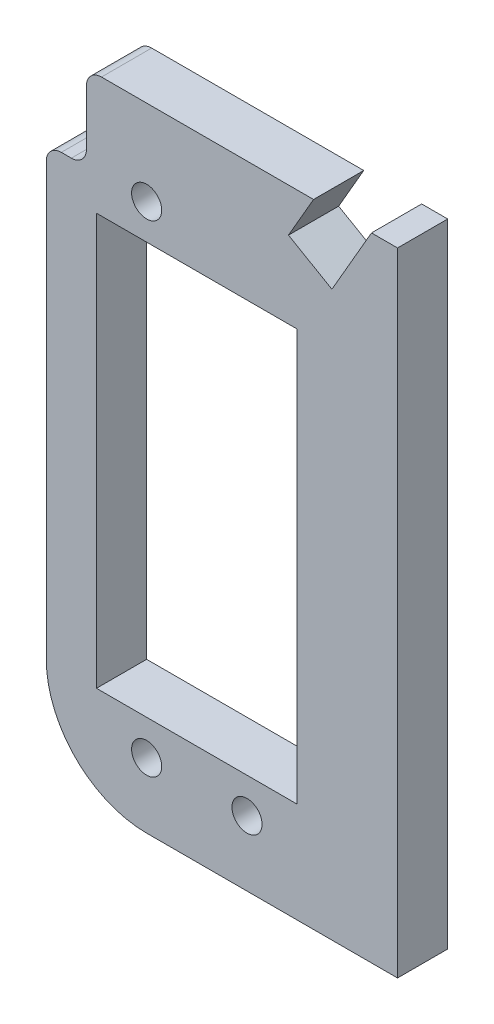
ISO-10303-21;
HEADER;
FILE_DESCRIPTION(('STEP AP214'),'2;1');
FILE_NAME('part.step','',(''),(''),'','','');
FILE_SCHEMA(('AUTOMOTIVE_DESIGN { 1 0 10303 214 1 1 1 1 }'));
ENDSEC;
DATA;
#1=APPLICATION_CONTEXT('core data for automotive mechanical design processes');
#2=APPLICATION_PROTOCOL_DEFINITION('international standard','automotive_design',2000,#1);
#3=PRODUCT_CONTEXT('',#1,'mechanical');
#4=PRODUCT('Part','Part','',(#3));
#5=PRODUCT_RELATED_PRODUCT_CATEGORY('part','',(#4));
#6=PRODUCT_DEFINITION_FORMATION('','',#4);
#7=PRODUCT_DEFINITION_CONTEXT('part definition',#1,'design');
#8=PRODUCT_DEFINITION('design','',#6,#7);
#9=PRODUCT_DEFINITION_SHAPE('','',#8);
#10=(LENGTH_UNIT() NAMED_UNIT(*) SI_UNIT(.MILLI.,.METRE.));
#11=(NAMED_UNIT(*) PLANE_ANGLE_UNIT() SI_UNIT($,.RADIAN.));
#12=(NAMED_UNIT(*) SI_UNIT($,.STERADIAN.) SOLID_ANGLE_UNIT());
#13=UNCERTAINTY_MEASURE_WITH_UNIT(LENGTH_MEASURE(1.E-05),#10,'distance_accuracy_value','');
#14=(GEOMETRIC_REPRESENTATION_CONTEXT(3) GLOBAL_UNCERTAINTY_ASSIGNED_CONTEXT((#13)) GLOBAL_UNIT_ASSIGNED_CONTEXT((#10,
#11,#12)) REPRESENTATION_CONTEXT('',''));
#15=CARTESIAN_POINT('',(0.,0.,0.));
#16=DIRECTION('',(0.,0.,1.));
#17=DIRECTION('',(1.,0.,0.));
#18=AXIS2_PLACEMENT_3D('',#15,#16,#17);
#19=CARTESIAN_POINT('',(0.,51.,5.));
#20=DIRECTION('',(0.,-1.,0.));
#21=DIRECTION('',(1.,0.,0.));
#22=AXIS2_PLACEMENT_3D('',#19,#20,#21);
#23=PLANE('',#22);
#24=DIRECTION('',(-1.,0.,0.));
#25=VECTOR('',#24,1.);
#26=CARTESIAN_POINT('',(0.,51.,0.));
#27=LINE('',#26,#25);
#28=CARTESIAN_POINT('',(25.,51.,0.));
#29=VERTEX_POINT('',#28);
#30=CARTESIAN_POINT('',(5.,51.,0.));
#31=VERTEX_POINT('',#30);
#32=EDGE_CURVE('E245',#29,#31,#27,.T.);
#33=ORIENTED_EDGE('',*,*,#32,.F.);
#34=DIRECTION('',(0.,0.,-1.));
#35=VECTOR('',#34,1.);
#36=CARTESIAN_POINT('',(25.,51.,5.));
#37=LINE('',#36,#35);
#38=CARTESIAN_POINT('',(25.,51.,5.));
#39=VERTEX_POINT('',#38);
#40=EDGE_CURVE('E272',#39,#29,#37,.T.);
#41=ORIENTED_EDGE('',*,*,#40,.F.);
#42=DIRECTION('',(-1.,0.,0.));
#43=VECTOR('',#42,1.);
#44=CARTESIAN_POINT('',(0.,51.,5.));
#45=LINE('',#44,#43);
#46=CARTESIAN_POINT('',(5.,51.,5.));
#47=VERTEX_POINT('',#46);
#48=EDGE_CURVE('E201',#39,#47,#45,.T.);
#49=ORIENTED_EDGE('',*,*,#48,.T.);
#50=DIRECTION('',(0.,0.,-1.));
#51=VECTOR('',#50,1.);
#52=CARTESIAN_POINT('',(5.,51.,5.));
#53=LINE('',#52,#51);
#54=EDGE_CURVE('E184',#47,#31,#53,.T.);
#55=ORIENTED_EDGE('',*,*,#54,.T.);
#56=EDGE_LOOP('',(#33,#41,#49,#55));
#57=FACE_BOUND('',#56,.T.);
#58=ADVANCED_FACE('F35',(#57),#23,.T.);
#59=CARTESIAN_POINT('',(25.,0.,5.));
#60=DIRECTION('',(-1.,0.,0.));
#61=DIRECTION('',(0.,0.,1.));
#62=AXIS2_PLACEMENT_3D('',#59,#60,#61);
#63=PLANE('',#62);
#64=DIRECTION('',(0.,1.,0.));
#65=VECTOR('',#64,1.);
#66=CARTESIAN_POINT('',(25.,0.,0.));
#67=LINE('',#66,#65);
#68=CARTESIAN_POINT('',(25.,10.,0.));
#69=VERTEX_POINT('',#68);
#70=EDGE_CURVE('E248',#69,#29,#67,.T.);
#71=ORIENTED_EDGE('',*,*,#70,.F.);
#72=DIRECTION('',(0.,0.,-1.));
#73=VECTOR('',#72,1.);
#74=CARTESIAN_POINT('',(25.,10.,5.));
#75=LINE('',#74,#73);
#76=CARTESIAN_POINT('',(25.,10.,5.));
#77=VERTEX_POINT('',#76);
#78=EDGE_CURVE('E270',#77,#69,#75,.T.);
#79=ORIENTED_EDGE('',*,*,#78,.F.);
#80=DIRECTION('',(0.,1.,0.));
#81=VECTOR('',#80,1.);
#82=CARTESIAN_POINT('',(25.,0.,5.));
#83=LINE('',#82,#81);
#84=EDGE_CURVE('E204',#77,#39,#83,.T.);
#85=ORIENTED_EDGE('',*,*,#84,.T.);
#86=ORIENTED_EDGE('',*,*,#40,.T.);
#87=EDGE_LOOP('',(#71,#79,#85,#86));
#88=FACE_BOUND('',#87,.T.);
#89=ADVANCED_FACE('F358',(#88),#63,.T.);
#90=CARTESIAN_POINT('',(0.,10.,5.));
#91=DIRECTION('',(0.,-1.,0.));
#92=DIRECTION('',(0.,0.,-1.));
#93=AXIS2_PLACEMENT_3D('',#90,#91,#92);
#94=PLANE('',#93);
#95=DIRECTION('',(-1.,0.,0.));
#96=VECTOR('',#95,1.);
#97=CARTESIAN_POINT('',(0.,10.,0.));
#98=LINE('',#97,#96);
#99=CARTESIAN_POINT('',(5.,10.,0.));
#100=VERTEX_POINT('',#99);
#101=EDGE_CURVE('E251',#69,#100,#98,.T.);
#102=ORIENTED_EDGE('',*,*,#101,.T.);
#103=DIRECTION('',(0.,0.,-1.));
#104=VECTOR('',#103,1.);
#105=CARTESIAN_POINT('',(5.,10.,5.));
#106=LINE('',#105,#104);
#107=CARTESIAN_POINT('',(5.,10.,5.));
#108=VERTEX_POINT('',#107);
#109=EDGE_CURVE('E268',#108,#100,#106,.T.);
#110=ORIENTED_EDGE('',*,*,#109,.F.);
#111=DIRECTION('',(-1.,0.,0.));
#112=VECTOR('',#111,1.);
#113=CARTESIAN_POINT('',(0.,10.,5.));
#114=LINE('',#113,#112);
#115=EDGE_CURVE('E207',#77,#108,#114,.T.);
#116=ORIENTED_EDGE('',*,*,#115,.F.);
#117=ORIENTED_EDGE('',*,*,#78,.T.);
#118=EDGE_LOOP('',(#102,#110,#116,#117));
#119=FACE_BOUND('',#118,.T.);
#120=ADVANCED_FACE('F364',(#119),#94,.F.);
#121=CARTESIAN_POINT('',(0.,63.,5.));
#122=DIRECTION('',(0.,1.,0.));
#123=DIRECTION('',(-1.,0.,0.));
#124=AXIS2_PLACEMENT_3D('',#121,#122,#123);
#125=PLANE('',#124);
#126=DIRECTION('',(1.,0.,0.));
#127=VECTOR('',#126,1.);
#128=CARTESIAN_POINT('',(0.,63.,0.));
#129=LINE('',#128,#127);
#130=CARTESIAN_POINT('',(5.5,63.,0.));
#131=VERTEX_POINT('',#130);
#132=CARTESIAN_POINT('',(26.6319834092185,63.,0.));
#133=VERTEX_POINT('',#132);
#134=EDGE_CURVE('E222',#131,#133,#129,.T.);
#135=ORIENTED_EDGE('',*,*,#134,.F.);
#136=DIRECTION('',(0.,0.,-1.));
#137=VECTOR('',#136,1.);
#138=CARTESIAN_POINT('',(5.5,63.,5.));
#139=LINE('',#138,#137);
#140=CARTESIAN_POINT('',(5.5,63.,5.));
#141=VERTEX_POINT('',#140);
#142=EDGE_CURVE('E311',#131,#141,#139,.F.);
#143=ORIENTED_EDGE('',*,*,#142,.T.);
#144=DIRECTION('',(1.,0.,0.));
#145=VECTOR('',#144,1.);
#146=CARTESIAN_POINT('',(0.,63.,5.));
#147=LINE('',#146,#145);
#148=CARTESIAN_POINT('',(26.6319834092185,63.,5.));
#149=VERTEX_POINT('',#148);
#150=EDGE_CURVE('E266',#141,#149,#147,.T.);
#151=ORIENTED_EDGE('',*,*,#150,.T.);
#152=DIRECTION('',(0.,0.,-1.));
#153=VECTOR('',#152,1.);
#154=CARTESIAN_POINT('',(26.6319834092185,63.,5.));
#155=LINE('',#154,#153);
#156=EDGE_CURVE('E221',#149,#133,#155,.T.);
#157=ORIENTED_EDGE('',*,*,#156,.T.);
#158=EDGE_LOOP('',(#135,#143,#151,#157));
#159=FACE_BOUND('',#158,.T.);
#160=ADVANCED_FACE('F335',(#159),#125,.T.);
#161=CARTESIAN_POINT('',(4.00000000000001,0.,5.));
#162=DIRECTION('',(1.,0.,0.));
#163=DIRECTION('',(0.,1.,0.));
#164=AXIS2_PLACEMENT_3D('',#161,#162,#163);
#165=PLANE('',#164);
#166=DIRECTION('',(0.,-1.,0.));
#167=VECTOR('',#166,1.);
#168=CARTESIAN_POINT('',(4.00000000000001,0.,5.));
#169=LINE('',#168,#167);
#170=CARTESIAN_POINT('',(4.,61.5,5.));
#171=VERTEX_POINT('',#170);
#172=CARTESIAN_POINT('',(4.,56.,5.));
#173=VERTEX_POINT('',#172);
#174=EDGE_CURVE('E325',#171,#173,#169,.T.);
#175=ORIENTED_EDGE('',*,*,#174,.F.);
#176=DIRECTION('',(0.,0.,-1.));
#177=VECTOR('',#176,1.);
#178=CARTESIAN_POINT('',(4.,61.5,0.));
#179=LINE('',#178,#177);
#180=CARTESIAN_POINT('',(4.,61.5,0.));
#181=VERTEX_POINT('',#180);
#182=EDGE_CURVE('E308',#171,#181,#179,.T.);
#183=ORIENTED_EDGE('',*,*,#182,.T.);
#184=DIRECTION('',(0.,-1.,0.));
#185=VECTOR('',#184,1.);
#186=CARTESIAN_POINT('',(4.00000000000001,0.,0.));
#187=LINE('',#186,#185);
#188=CARTESIAN_POINT('',(4.,56.,0.));
#189=VERTEX_POINT('',#188);
#190=EDGE_CURVE('E224',#181,#189,#187,.T.);
#191=ORIENTED_EDGE('',*,*,#190,.T.);
#192=DIRECTION('',(0.,0.,-1.));
#193=VECTOR('',#192,1.);
#194=CARTESIAN_POINT('',(4.,56.,5.));
#195=LINE('',#194,#193);
#196=EDGE_CURVE('E50',#189,#173,#195,.F.);
#197=ORIENTED_EDGE('',*,*,#196,.T.);
#198=EDGE_LOOP('',(#175,#183,#191,#197));
#199=FACE_BOUND('',#198,.T.);
#200=ADVANCED_FACE('F319',(#199),#165,.F.);
#201=CARTESIAN_POINT('',(0.,54.5,5.));
#202=DIRECTION('',(0.,1.,0.));
#203=DIRECTION('',(0.,0.,1.));
#204=AXIS2_PLACEMENT_3D('',#201,#202,#203);
#205=PLANE('',#204);
#206=DIRECTION('',(1.,0.,0.));
#207=VECTOR('',#206,1.);
#208=CARTESIAN_POINT('',(0.,54.5,0.));
#209=LINE('',#208,#207);
#210=CARTESIAN_POINT('',(1.5,54.5,0.));
#211=VERTEX_POINT('',#210);
#212=CARTESIAN_POINT('',(2.5,54.5,0.));
#213=VERTEX_POINT('',#212);
#214=EDGE_CURVE('E226',#211,#213,#209,.T.);
#215=ORIENTED_EDGE('',*,*,#214,.F.);
#216=DIRECTION('',(0.,0.,-1.));
#217=VECTOR('',#216,1.);
#218=CARTESIAN_POINT('',(1.5,54.5,5.));
#219=LINE('',#218,#217);
#220=CARTESIAN_POINT('',(1.5,54.5,5.));
#221=VERTEX_POINT('',#220);
#222=EDGE_CURVE('E302',#211,#221,#219,.F.);
#223=ORIENTED_EDGE('',*,*,#222,.T.);
#224=DIRECTION('',(1.,0.,0.));
#225=VECTOR('',#224,1.);
#226=CARTESIAN_POINT('',(0.,54.5,5.));
#227=LINE('',#226,#225);
#228=CARTESIAN_POINT('',(2.5,54.5,5.));
#229=VERTEX_POINT('',#228);
#230=EDGE_CURVE('E323',#221,#229,#227,.T.);
#231=ORIENTED_EDGE('',*,*,#230,.T.);
#232=DIRECTION('',(0.,0.,-1.));
#233=VECTOR('',#232,1.);
#234=CARTESIAN_POINT('',(2.5,54.5,5.));
#235=LINE('',#234,#233);
#236=EDGE_CURVE('E299',#229,#213,#235,.T.);
#237=ORIENTED_EDGE('',*,*,#236,.T.);
#238=EDGE_LOOP('',(#215,#223,#231,#237));
#239=FACE_BOUND('',#238,.T.);
#240=ADVANCED_FACE('F327',(#239),#205,.T.);
#241=CARTESIAN_POINT('',(0.,0.,5.));
#242=DIRECTION('',(-1.,0.,0.));
#243=DIRECTION('',(0.,0.,1.));
#244=AXIS2_PLACEMENT_3D('',#241,#242,#243);
#245=PLANE('',#244);
#246=DIRECTION('',(0.,1.,0.));
#247=VECTOR('',#246,1.);
#248=CARTESIAN_POINT('',(0.,0.,5.));
#249=LINE('',#248,#247);
#250=CARTESIAN_POINT('',(0.,10.,5.));
#251=VERTEX_POINT('',#250);
#252=CARTESIAN_POINT('',(0.,53.,5.));
#253=VERTEX_POINT('',#252);
#254=EDGE_CURVE('E174',#251,#253,#249,.T.);
#255=ORIENTED_EDGE('',*,*,#254,.T.);
#256=DIRECTION('',(0.,0.,-1.));
#257=VECTOR('',#256,1.);
#258=CARTESIAN_POINT('',(0.,53.,5.));
#259=LINE('',#258,#257);
#260=CARTESIAN_POINT('',(0.,53.,0.));
#261=VERTEX_POINT('',#260);
#262=EDGE_CURVE('E292',#253,#261,#259,.T.);
#263=ORIENTED_EDGE('',*,*,#262,.T.);
#264=DIRECTION('',(0.,1.,0.));
#265=VECTOR('',#264,1.);
#266=CARTESIAN_POINT('',(0.,0.,0.));
#267=LINE('',#266,#265);
#268=CARTESIAN_POINT('',(0.,10.,0.));
#269=VERTEX_POINT('',#268);
#270=EDGE_CURVE('E229',#269,#261,#267,.T.);
#271=ORIENTED_EDGE('',*,*,#270,.F.);
#272=DIRECTION('',(0.,0.,-1.));
#273=VECTOR('',#272,1.);
#274=CARTESIAN_POINT('',(0.,10.,5.));
#275=LINE('',#274,#273);
#276=EDGE_CURVE('E289',#269,#251,#275,.F.);
#277=ORIENTED_EDGE('',*,*,#276,.T.);
#278=EDGE_LOOP('',(#255,#263,#271,#277));
#279=FACE_BOUND('',#278,.T.);
#280=ADVANCED_FACE('F391',(#279),#245,.T.);
#281=CARTESIAN_POINT('',(0.,0.,5.));
#282=DIRECTION('',(0.,1.,0.));
#283=DIRECTION('',(0.,0.,1.));
#284=AXIS2_PLACEMENT_3D('',#281,#282,#283);
#285=PLANE('',#284);
#286=DIRECTION('',(1.,0.,0.));
#287=VECTOR('',#286,1.);
#288=CARTESIAN_POINT('',(0.,0.,5.));
#289=LINE('',#288,#287);
#290=CARTESIAN_POINT('',(10.,0.,5.));
#291=VERTEX_POINT('',#290);
#292=CARTESIAN_POINT('',(35.,0.,5.));
#293=VERTEX_POINT('',#292);
#294=EDGE_CURVE('E159',#291,#293,#289,.T.);
#295=ORIENTED_EDGE('',*,*,#294,.F.);
#296=DIRECTION('',(0.,0.,-1.));
#297=VECTOR('',#296,1.);
#298=CARTESIAN_POINT('',(10.,0.,0.));
#299=LINE('',#298,#297);
#300=CARTESIAN_POINT('',(10.,0.,0.));
#301=VERTEX_POINT('',#300);
#302=EDGE_CURVE('E274',#291,#301,#299,.T.);
#303=ORIENTED_EDGE('',*,*,#302,.T.);
#304=DIRECTION('',(1.,0.,0.));
#305=VECTOR('',#304,1.);
#306=CARTESIAN_POINT('',(0.,0.,0.));
#307=LINE('',#306,#305);
#308=CARTESIAN_POINT('',(35.,0.,0.));
#309=VERTEX_POINT('',#308);
#310=EDGE_CURVE('E180',#301,#309,#307,.T.);
#311=ORIENTED_EDGE('',*,*,#310,.T.);
#312=DIRECTION('',(0.,0.,-1.));
#313=VECTOR('',#312,1.);
#314=CARTESIAN_POINT('',(35.,0.,5.));
#315=LINE('',#314,#313);
#316=EDGE_CURVE('E177',#293,#309,#315,.T.);
#317=ORIENTED_EDGE('',*,*,#316,.F.);
#318=EDGE_LOOP('',(#295,#303,#311,#317));
#319=FACE_BOUND('',#318,.T.);
#320=ADVANCED_FACE('F178',(#319),#285,.F.);
#321=CARTESIAN_POINT('',(35.,0.,5.));
#322=DIRECTION('',(-1.,0.,0.));
#323=DIRECTION('',(0.,0.,1.));
#324=AXIS2_PLACEMENT_3D('',#321,#322,#323);
#325=PLANE('',#324);
#326=DIRECTION('',(0.,1.,0.));
#327=VECTOR('',#326,1.);
#328=CARTESIAN_POINT('',(35.,0.,0.));
#329=LINE('',#328,#327);
#330=CARTESIAN_POINT('',(35.,63.,0.));
#331=VERTEX_POINT('',#330);
#332=EDGE_CURVE('E233',#309,#331,#329,.T.);
#333=ORIENTED_EDGE('',*,*,#332,.T.);
#334=DIRECTION('',(0.,0.,-1.));
#335=VECTOR('',#334,1.);
#336=CARTESIAN_POINT('',(35.,63.,5.));
#337=LINE('',#336,#335);
#338=CARTESIAN_POINT('',(35.,63.,5.));
#339=VERTEX_POINT('',#338);
#340=EDGE_CURVE('E185',#339,#331,#337,.T.);
#341=ORIENTED_EDGE('',*,*,#340,.F.);
#342=DIRECTION('',(0.,1.,0.));
#343=VECTOR('',#342,1.);
#344=CARTESIAN_POINT('',(35.,0.,5.));
#345=LINE('',#344,#343);
#346=EDGE_CURVE('E166',#293,#339,#345,.T.);
#347=ORIENTED_EDGE('',*,*,#346,.F.);
#348=ORIENTED_EDGE('',*,*,#316,.T.);
#349=EDGE_LOOP('',(#333,#341,#347,#348));
#350=FACE_BOUND('',#349,.T.);
#351=ADVANCED_FACE('F187',(#350),#325,.F.);
#352=CARTESIAN_POINT('',(-3.36980515798336E-13,62.9999999999998,5.));
#353=DIRECTION('',(0.,1.,0.));
#354=DIRECTION('',(-1.,0.,0.));
#355=AXIS2_PLACEMENT_3D('',#352,#353,#354);
#356=PLANE('',#355);
#357=DIRECTION('',(1.,0.,0.));
#358=VECTOR('',#357,1.);
#359=CARTESIAN_POINT('',(-3.36980515798336E-13,62.9999999999998,0.));
#360=LINE('',#359,#358);
#361=CARTESIAN_POINT('',(32.4054861011147,63.,0.));
#362=VERTEX_POINT('',#361);
#363=EDGE_CURVE('E235',#362,#331,#360,.T.);
#364=ORIENTED_EDGE('',*,*,#363,.F.);
#365=DIRECTION('',(0.,0.,-1.));
#366=VECTOR('',#365,1.);
#367=CARTESIAN_POINT('',(32.4054861011147,63.,5.));
#368=LINE('',#367,#366);
#369=CARTESIAN_POINT('',(32.4054861011147,63.,5.));
#370=VERTEX_POINT('',#369);
#371=EDGE_CURVE('E283',#370,#362,#368,.T.);
#372=ORIENTED_EDGE('',*,*,#371,.F.);
#373=DIRECTION('',(1.,0.,0.));
#374=VECTOR('',#373,1.);
#375=CARTESIAN_POINT('',(-3.36980515798336E-13,62.9999999999998,5.));
#376=LINE('',#375,#374);
#377=EDGE_CURVE('E189',#370,#339,#376,.T.);
#378=ORIENTED_EDGE('',*,*,#377,.T.);
#379=ORIENTED_EDGE('',*,*,#340,.T.);
#380=EDGE_LOOP('',(#364,#372,#378,#379));
#381=FACE_BOUND('',#380,.T.);
#382=ADVANCED_FACE('F382',(#381),#356,.T.);
#383=CARTESIAN_POINT('',(-2.97568564337374,1.71801290722553,5.));
#384=DIRECTION('',(0.866025403784439,-0.5,0.));
#385=DIRECTION('',(0.5,0.866025403784439,0.));
#386=AXIS2_PLACEMENT_3D('',#383,#384,#385);
#387=PLANE('',#386);
#388=DIRECTION('',(-0.5,-0.866025403784439,0.));
#389=VECTOR('',#388,1.);
#390=CARTESIAN_POINT('',(-2.97568564337374,1.71801290722553,0.));
#391=LINE('',#390,#389);
#392=CARTESIAN_POINT('',(28.4621104281407,56.1698729810778,0.));
#393=VERTEX_POINT('',#392);
#394=EDGE_CURVE('E238',#362,#393,#391,.T.);
#395=ORIENTED_EDGE('',*,*,#394,.T.);
#396=DIRECTION('',(0.,0.,-1.));
#397=VECTOR('',#396,1.);
#398=CARTESIAN_POINT('',(28.4621104281407,56.1698729810778,5.));
#399=LINE('',#398,#397);
#400=CARTESIAN_POINT('',(28.4621104281407,56.1698729810778,5.));
#401=VERTEX_POINT('',#400);
#402=EDGE_CURVE('E280',#401,#393,#399,.T.);
#403=ORIENTED_EDGE('',*,*,#402,.F.);
#404=DIRECTION('',(-0.5,-0.866025403784439,0.));
#405=VECTOR('',#404,1.);
#406=CARTESIAN_POINT('',(-2.97568564337374,1.71801290722553,5.));
#407=LINE('',#406,#405);
#408=EDGE_CURVE('E191',#370,#401,#407,.T.);
#409=ORIENTED_EDGE('',*,*,#408,.F.);
#410=ORIENTED_EDGE('',*,*,#371,.T.);
#411=EDGE_LOOP('',(#395,#403,#409,#410));
#412=FACE_BOUND('',#411,.T.);
#413=ADVANCED_FACE('F378',(#412),#387,.F.);
#414=CARTESIAN_POINT('',(31.4377960715144,54.4518600738523,5.));
#415=DIRECTION('',(-0.5,-0.866025403784439,0.));
#416=DIRECTION('',(0.866025403784439,-0.5,0.));
#417=AXIS2_PLACEMENT_3D('',#414,#415,#416);
#418=PLANE('',#417);
#419=DIRECTION('',(-0.866025403784439,0.5,0.));
#420=VECTOR('',#419,1.);
#421=CARTESIAN_POINT('',(31.4377960715144,54.4518600738523,0.));
#422=LINE('',#421,#420);
#423=CARTESIAN_POINT('',(24.1319834092185,58.6698729810778,0.));
#424=VERTEX_POINT('',#423);
#425=EDGE_CURVE('E240',#393,#424,#422,.T.);
#426=ORIENTED_EDGE('',*,*,#425,.T.);
#427=DIRECTION('',(0.,0.,-1.));
#428=VECTOR('',#427,1.);
#429=CARTESIAN_POINT('',(24.1319834092185,58.6698729810778,5.));
#430=LINE('',#429,#428);
#431=CARTESIAN_POINT('',(24.1319834092185,58.6698729810778,5.));
#432=VERTEX_POINT('',#431);
#433=EDGE_CURVE('E277',#432,#424,#430,.T.);
#434=ORIENTED_EDGE('',*,*,#433,.F.);
#435=DIRECTION('',(-0.866025403784439,0.5,0.));
#436=VECTOR('',#435,1.);
#437=CARTESIAN_POINT('',(31.4377960715144,54.4518600738523,5.));
#438=LINE('',#437,#436);
#439=EDGE_CURVE('E196',#401,#432,#438,.T.);
#440=ORIENTED_EDGE('',*,*,#439,.F.);
#441=ORIENTED_EDGE('',*,*,#402,.T.);
#442=EDGE_LOOP('',(#426,#434,#440,#441));
#443=FACE_BOUND('',#442,.T.);
#444=ADVANCED_FACE('F374',(#443),#418,.F.);
#445=CARTESIAN_POINT('',(20.,6.50000000000001,5.));
#446=DIRECTION('',(0.,0.,-1.));
#447=DIRECTION('',(-1.,0.,0.));
#448=AXIS2_PLACEMENT_3D('',#445,#446,#447);
#449=CYLINDRICAL_SURFACE('',#448,1.5);
#450=CARTESIAN_POINT('',(20.,6.50000000000001,5.));
#451=DIRECTION('',(0.,0.,1.));
#452=DIRECTION('',(1.,0.,0.));
#453=AXIS2_PLACEMENT_3D('',#450,#451,#452);
#454=CIRCLE('',#453,1.5);
#455=CARTESIAN_POINT('',(21.5,6.50000000000001,5.));
#456=VERTEX_POINT('',#455);
#457=EDGE_CURVE('E215',#456,#456,#454,.T.);
#458=ORIENTED_EDGE('',*,*,#457,.T.);
#459=EDGE_LOOP('',(#458));
#460=FACE_BOUND('',#459,.T.);
#461=CARTESIAN_POINT('',(20.,6.50000000000001,0.));
#462=DIRECTION('',(0.,0.,1.));
#463=DIRECTION('',(1.,0.,0.));
#464=AXIS2_PLACEMENT_3D('',#461,#462,#463);
#465=CIRCLE('',#464,1.5);
#466=CARTESIAN_POINT('',(21.5,6.50000000000001,0.));
#467=VERTEX_POINT('',#466);
#468=EDGE_CURVE('E260',#467,#467,#465,.T.);
#469=ORIENTED_EDGE('',*,*,#468,.F.);
#470=EDGE_LOOP('',(#469));
#471=FACE_BOUND('',#470,.T.);
#472=ADVANCED_FACE('F377',(#460,#471),#449,.F.);
#473=CARTESIAN_POINT('',(9.99999999999999,54.5,5.));
#474=DIRECTION('',(0.,0.,-1.));
#475=DIRECTION('',(-1.,0.,0.));
#476=AXIS2_PLACEMENT_3D('',#473,#474,#475);
#477=CYLINDRICAL_SURFACE('',#476,1.5);
#478=CARTESIAN_POINT('',(9.99999999999999,54.5,5.));
#479=DIRECTION('',(0.,0.,1.));
#480=DIRECTION('',(1.,0.,0.));
#481=AXIS2_PLACEMENT_3D('',#478,#479,#480);
#482=CIRCLE('',#481,1.5);
#483=CARTESIAN_POINT('',(11.5,54.5,5.));
#484=VERTEX_POINT('',#483);
#485=EDGE_CURVE('E212',#484,#484,#482,.T.);
#486=ORIENTED_EDGE('',*,*,#485,.T.);
#487=EDGE_LOOP('',(#486));
#488=FACE_BOUND('',#487,.T.);
#489=CARTESIAN_POINT('',(9.99999999999999,54.5,0.));
#490=DIRECTION('',(0.,0.,1.));
#491=DIRECTION('',(1.,0.,0.));
#492=AXIS2_PLACEMENT_3D('',#489,#490,#491);
#493=CIRCLE('',#492,1.5);
#494=CARTESIAN_POINT('',(11.5,54.5,0.));
#495=VERTEX_POINT('',#494);
#496=EDGE_CURVE('E257',#495,#495,#493,.T.);
#497=ORIENTED_EDGE('',*,*,#496,.F.);
#498=EDGE_LOOP('',(#497));
#499=FACE_BOUND('',#498,.T.);
#500=ADVANCED_FACE('F424',(#488,#499),#477,.F.);
#501=CARTESIAN_POINT('',(5.,0.,5.));
#502=DIRECTION('',(1.,0.,0.));
#503=DIRECTION('',(0.,0.,-1.));
#504=AXIS2_PLACEMENT_3D('',#501,#502,#503);
#505=PLANE('',#504);
#506=DIRECTION('',(0.,-1.,0.));
#507=VECTOR('',#506,1.);
#508=CARTESIAN_POINT('',(5.,0.,0.));
#509=LINE('',#508,#507);
#510=EDGE_CURVE('E254',#31,#100,#509,.T.);
#511=ORIENTED_EDGE('',*,*,#510,.F.);
#512=ORIENTED_EDGE('',*,*,#54,.F.);
#513=DIRECTION('',(0.,-1.,0.));
#514=VECTOR('',#513,1.);
#515=CARTESIAN_POINT('',(5.,0.,5.));
#516=LINE('',#515,#514);
#517=EDGE_CURVE('E209',#47,#108,#516,.T.);
#518=ORIENTED_EDGE('',*,*,#517,.T.);
#519=ORIENTED_EDGE('',*,*,#109,.T.);
#520=EDGE_LOOP('',(#511,#512,#518,#519));
#521=FACE_BOUND('',#520,.T.);
#522=ADVANCED_FACE('F373',(#521),#505,.T.);
#523=CARTESIAN_POINT('',(-7.30581266229591,4.21801290722551,5.));
#524=DIRECTION('',(-0.866025403784439,0.499999999999999,0.));
#525=DIRECTION('',(-0.499999999999999,-0.866025403784439,0.));
#526=AXIS2_PLACEMENT_3D('',#523,#524,#525);
#527=PLANE('',#526);
#528=DIRECTION('',(0.499999999999999,0.866025403784439,0.));
#529=VECTOR('',#528,1.);
#530=CARTESIAN_POINT('',(-7.30581266229591,4.21801290722551,0.));
#531=LINE('',#530,#529);
#532=EDGE_CURVE('E242',#424,#133,#531,.T.);
#533=ORIENTED_EDGE('',*,*,#532,.T.);
#534=ORIENTED_EDGE('',*,*,#156,.F.);
#535=DIRECTION('',(0.499999999999999,0.866025403784439,0.));
#536=VECTOR('',#535,1.);
#537=CARTESIAN_POINT('',(-7.30581266229591,4.21801290722551,5.));
#538=LINE('',#537,#536);
#539=EDGE_CURVE('E198',#432,#149,#538,.T.);
#540=ORIENTED_EDGE('',*,*,#539,.F.);
#541=ORIENTED_EDGE('',*,*,#433,.T.);
#542=EDGE_LOOP('',(#533,#534,#540,#541));
#543=FACE_BOUND('',#542,.T.);
#544=ADVANCED_FACE('F342',(#543),#527,.F.);
#545=CARTESIAN_POINT('',(9.99999999999999,6.50000000000001,5.));
#546=DIRECTION('',(0.,0.,-1.));
#547=DIRECTION('',(-1.,0.,0.));
#548=AXIS2_PLACEMENT_3D('',#545,#546,#547);
#549=CYLINDRICAL_SURFACE('',#548,1.5);
#550=CARTESIAN_POINT('',(9.99999999999999,6.50000000000001,5.));
#551=DIRECTION('',(0.,0.,1.));
#552=DIRECTION('',(1.,0.,0.));
#553=AXIS2_PLACEMENT_3D('',#550,#551,#552);
#554=CIRCLE('',#553,1.5);
#555=CARTESIAN_POINT('',(11.5,6.50000000000001,5.));
#556=VERTEX_POINT('',#555);
#557=EDGE_CURVE('E218',#556,#556,#554,.F.);
#558=ORIENTED_EDGE('',*,*,#557,.F.);
#559=EDGE_LOOP('',(#558));
#560=FACE_BOUND('',#559,.T.);
#561=CARTESIAN_POINT('',(9.99999999999999,6.50000000000001,0.));
#562=DIRECTION('',(0.,0.,1.));
#563=DIRECTION('',(1.,0.,0.));
#564=AXIS2_PLACEMENT_3D('',#561,#562,#563);
#565=CIRCLE('',#564,1.5);
#566=CARTESIAN_POINT('',(11.5,6.50000000000001,0.));
#567=VERTEX_POINT('',#566);
#568=EDGE_CURVE('E263',#567,#567,#565,.F.);
#569=ORIENTED_EDGE('',*,*,#568,.T.);
#570=EDGE_LOOP('',(#569));
#571=FACE_BOUND('',#570,.T.);
#572=ADVANCED_FACE('F372',(#560,#571),#549,.F.);
#573=CARTESIAN_POINT('',(0.,0.,5.));
#574=DIRECTION('',(0.,0.,1.));
#575=DIRECTION('',(1.,0.,0.));
#576=AXIS2_PLACEMENT_3D('',#573,#574,#575);
#577=PLANE('',#576);
#578=ORIENTED_EDGE('',*,*,#230,.F.);
#579=CARTESIAN_POINT('',(1.5,53.,5.));
#580=DIRECTION('',(0.,0.,1.));
#581=DIRECTION('',(1.,0.,0.));
#582=AXIS2_PLACEMENT_3D('',#579,#580,#581);
#583=CIRCLE('',#582,1.5);
#584=EDGE_CURVE('E305',#221,#253,#583,.T.);
#585=ORIENTED_EDGE('',*,*,#584,.T.);
#586=ORIENTED_EDGE('',*,*,#254,.F.);
#587=CARTESIAN_POINT('',(10.,10.,5.));
#588=DIRECTION('',(0.,0.,1.));
#589=DIRECTION('',(1.,0.,0.));
#590=AXIS2_PLACEMENT_3D('',#587,#588,#589);
#591=CIRCLE('',#590,10.);
#592=EDGE_CURVE('E170',#251,#291,#591,.T.);
#593=ORIENTED_EDGE('',*,*,#592,.T.);
#594=ORIENTED_EDGE('',*,*,#294,.T.);
#595=ORIENTED_EDGE('',*,*,#346,.T.);
#596=ORIENTED_EDGE('',*,*,#377,.F.);
#597=ORIENTED_EDGE('',*,*,#408,.T.);
#598=ORIENTED_EDGE('',*,*,#439,.T.);
#599=ORIENTED_EDGE('',*,*,#539,.T.);
#600=ORIENTED_EDGE('',*,*,#150,.F.);
#601=CARTESIAN_POINT('',(5.5,61.5,5.));
#602=DIRECTION('',(0.,0.,1.));
#603=DIRECTION('',(1.,0.,0.));
#604=AXIS2_PLACEMENT_3D('',#601,#602,#603);
#605=CIRCLE('',#604,1.5);
#606=EDGE_CURVE('E57',#141,#171,#605,.T.);
#607=ORIENTED_EDGE('',*,*,#606,.T.);
#608=ORIENTED_EDGE('',*,*,#174,.T.);
#609=CARTESIAN_POINT('',(2.5,56.,5.));
#610=DIRECTION('',(0.,0.,1.));
#611=DIRECTION('',(1.,0.,0.));
#612=AXIS2_PLACEMENT_3D('',#609,#610,#611);
#613=CIRCLE('',#612,1.5);
#614=EDGE_CURVE('E11',#173,#229,#613,.F.);
#615=ORIENTED_EDGE('',*,*,#614,.T.);
#616=EDGE_LOOP('',(#578,#585,#586,#593,#594,#595,#596,#597,#598,#599,#600,#607,#608,#615));
#617=FACE_BOUND('',#616,.T.);
#618=ORIENTED_EDGE('',*,*,#48,.F.);
#619=ORIENTED_EDGE('',*,*,#84,.F.);
#620=ORIENTED_EDGE('',*,*,#115,.T.);
#621=ORIENTED_EDGE('',*,*,#517,.F.);
#622=EDGE_LOOP('',(#618,#619,#620,#621));
#623=FACE_BOUND('',#622,.T.);
#624=ORIENTED_EDGE('',*,*,#485,.F.);
#625=EDGE_LOOP('',(#624));
#626=FACE_BOUND('',#625,.T.);
#627=ORIENTED_EDGE('',*,*,#457,.F.);
#628=EDGE_LOOP('',(#627));
#629=FACE_BOUND('',#628,.T.);
#630=ORIENTED_EDGE('',*,*,#557,.T.);
#631=EDGE_LOOP('',(#630));
#632=FACE_BOUND('',#631,.T.);
#633=ADVANCED_FACE('F162',(#617,#623,#626,#629,#632),#577,.T.);
#634=CARTESIAN_POINT('',(0.,0.,0.));
#635=DIRECTION('',(0.,0.,1.));
#636=DIRECTION('',(1.,0.,0.));
#637=AXIS2_PLACEMENT_3D('',#634,#635,#636);
#638=PLANE('',#637);
#639=ORIENTED_EDGE('',*,*,#270,.T.);
#640=CARTESIAN_POINT('',(1.5,53.,0.));
#641=DIRECTION('',(0.,0.,1.));
#642=DIRECTION('',(1.,0.,0.));
#643=AXIS2_PLACEMENT_3D('',#640,#641,#642);
#644=CIRCLE('',#643,1.5);
#645=EDGE_CURVE('E297',#261,#211,#644,.F.);
#646=ORIENTED_EDGE('',*,*,#645,.T.);
#647=ORIENTED_EDGE('',*,*,#214,.T.);
#648=CARTESIAN_POINT('',(2.5,56.,0.));
#649=DIRECTION('',(0.,0.,1.));
#650=DIRECTION('',(1.,0.,0.));
#651=AXIS2_PLACEMENT_3D('',#648,#649,#650);
#652=CIRCLE('',#651,1.5);
#653=EDGE_CURVE('E43',#213,#189,#652,.T.);
#654=ORIENTED_EDGE('',*,*,#653,.T.);
#655=ORIENTED_EDGE('',*,*,#190,.F.);
#656=CARTESIAN_POINT('',(5.5,61.5,0.));
#657=DIRECTION('',(0.,0.,1.));
#658=DIRECTION('',(1.,0.,0.));
#659=AXIS2_PLACEMENT_3D('',#656,#657,#658);
#660=CIRCLE('',#659,1.5);
#661=EDGE_CURVE('E295',#181,#131,#660,.F.);
#662=ORIENTED_EDGE('',*,*,#661,.T.);
#663=ORIENTED_EDGE('',*,*,#134,.T.);
#664=ORIENTED_EDGE('',*,*,#532,.F.);
#665=ORIENTED_EDGE('',*,*,#425,.F.);
#666=ORIENTED_EDGE('',*,*,#394,.F.);
#667=ORIENTED_EDGE('',*,*,#363,.T.);
#668=ORIENTED_EDGE('',*,*,#332,.F.);
#669=ORIENTED_EDGE('',*,*,#310,.F.);
#670=CARTESIAN_POINT('',(10.,10.,0.));
#671=DIRECTION('',(0.,0.,1.));
#672=DIRECTION('',(1.,0.,0.));
#673=AXIS2_PLACEMENT_3D('',#670,#671,#672);
#674=CIRCLE('',#673,10.);
#675=EDGE_CURVE('E287',#301,#269,#674,.F.);
#676=ORIENTED_EDGE('',*,*,#675,.T.);
#677=EDGE_LOOP('',(#639,#646,#647,#654,#655,#662,#663,#664,#665,#666,#667,#668,#669,#676));
#678=FACE_BOUND('',#677,.T.);
#679=ORIENTED_EDGE('',*,*,#32,.T.);
#680=ORIENTED_EDGE('',*,*,#510,.T.);
#681=ORIENTED_EDGE('',*,*,#101,.F.);
#682=ORIENTED_EDGE('',*,*,#70,.T.);
#683=EDGE_LOOP('',(#679,#680,#681,#682));
#684=FACE_BOUND('',#683,.T.);
#685=ORIENTED_EDGE('',*,*,#496,.T.);
#686=EDGE_LOOP('',(#685));
#687=FACE_BOUND('',#686,.T.);
#688=ORIENTED_EDGE('',*,*,#468,.T.);
#689=EDGE_LOOP('',(#688));
#690=FACE_BOUND('',#689,.T.);
#691=ORIENTED_EDGE('',*,*,#568,.F.);
#692=EDGE_LOOP('',(#691));
#693=FACE_BOUND('',#692,.T.);
#694=ADVANCED_FACE('F314',(#678,#684,#687,#690,#693),#638,.F.);
#695=CARTESIAN_POINT('',(10.,10.,5.));
#696=DIRECTION('',(0.,0.,1.));
#697=DIRECTION('',(1.,0.,0.));
#698=AXIS2_PLACEMENT_3D('',#695,#696,#697);
#699=CYLINDRICAL_SURFACE('',#698,10.);
#700=ORIENTED_EDGE('',*,*,#592,.F.);
#701=ORIENTED_EDGE('',*,*,#276,.F.);
#702=ORIENTED_EDGE('',*,*,#675,.F.);
#703=ORIENTED_EDGE('',*,*,#302,.F.);
#704=EDGE_LOOP('',(#700,#701,#702,#703));
#705=FACE_BOUND('',#704,.T.);
#706=ADVANCED_FACE('F354',(#705),#699,.T.);
#707=CARTESIAN_POINT('',(1.5,53.,5.));
#708=DIRECTION('',(0.,0.,-1.));
#709=DIRECTION('',(-1.,0.,0.));
#710=AXIS2_PLACEMENT_3D('',#707,#708,#709);
#711=CYLINDRICAL_SURFACE('',#710,1.5);
#712=ORIENTED_EDGE('',*,*,#584,.F.);
#713=ORIENTED_EDGE('',*,*,#222,.F.);
#714=ORIENTED_EDGE('',*,*,#645,.F.);
#715=ORIENTED_EDGE('',*,*,#262,.F.);
#716=EDGE_LOOP('',(#712,#713,#714,#715));
#717=FACE_BOUND('',#716,.T.);
#718=ADVANCED_FACE('F349',(#717),#711,.T.);
#719=CARTESIAN_POINT('',(5.5,61.5,5.));
#720=DIRECTION('',(0.,0.,1.));
#721=DIRECTION('',(1.,0.,0.));
#722=AXIS2_PLACEMENT_3D('',#719,#720,#721);
#723=CYLINDRICAL_SURFACE('',#722,1.5);
#724=ORIENTED_EDGE('',*,*,#606,.F.);
#725=ORIENTED_EDGE('',*,*,#142,.F.);
#726=ORIENTED_EDGE('',*,*,#661,.F.);
#727=ORIENTED_EDGE('',*,*,#182,.F.);
#728=EDGE_LOOP('',(#724,#725,#726,#727));
#729=FACE_BOUND('',#728,.T.);
#730=ADVANCED_FACE('F347',(#729),#723,.T.);
#731=CARTESIAN_POINT('',(2.5,56.,5.));
#732=DIRECTION('',(0.,0.,-1.));
#733=DIRECTION('',(-1.,0.,0.));
#734=AXIS2_PLACEMENT_3D('',#731,#732,#733);
#735=CYLINDRICAL_SURFACE('',#734,1.5);
#736=ORIENTED_EDGE('',*,*,#614,.F.);
#737=ORIENTED_EDGE('',*,*,#196,.F.);
#738=ORIENTED_EDGE('',*,*,#653,.F.);
#739=ORIENTED_EDGE('',*,*,#236,.F.);
#740=EDGE_LOOP('',(#736,#737,#738,#739));
#741=FACE_BOUND('',#740,.T.);
#742=ADVANCED_FACE('F37',(#741),#735,.F.);
#743=CLOSED_SHELL('',(#58,#89,#120,#160,#200,#240,#280,#320,#351,#382,#413,#444,#472,#500,#522,
#544,#572,#633,#694,#706,#718,#730,#742));
#744=MANIFOLD_SOLID_BREP('B2',#743);
#745=ADVANCED_BREP_SHAPE_REPRESENTATION('',(#18,#744),#14);
#746=SHAPE_DEFINITION_REPRESENTATION(#9,#745);
ENDSEC;
END-ISO-10303-21;
